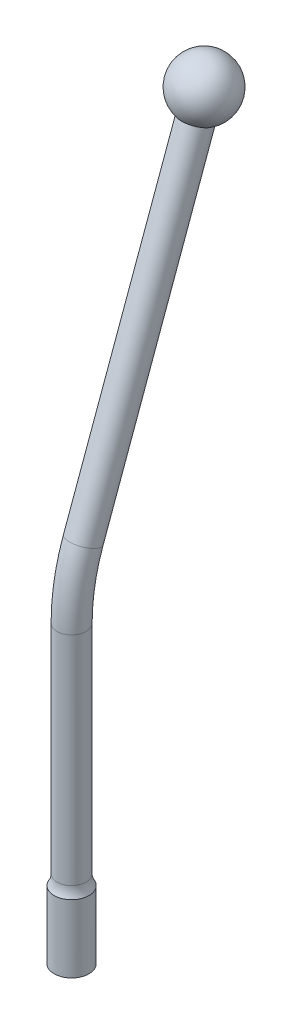
ISO-10303-21;
HEADER;
FILE_DESCRIPTION(('STEP AP214'),'2;1');
FILE_NAME('part.step','',(''),(''),'','','');
FILE_SCHEMA(('AUTOMOTIVE_DESIGN { 1 0 10303 214 1 1 1 1 }'));
ENDSEC;
DATA;
#1=APPLICATION_CONTEXT('core data for automotive mechanical design processes');
#2=APPLICATION_PROTOCOL_DEFINITION('international standard','automotive_design',2000,#1);
#3=PRODUCT_CONTEXT('',#1,'mechanical');
#4=PRODUCT('Part','Part','',(#3));
#5=PRODUCT_RELATED_PRODUCT_CATEGORY('part','',(#4));
#6=PRODUCT_DEFINITION_FORMATION('','',#4);
#7=PRODUCT_DEFINITION_CONTEXT('part definition',#1,'design');
#8=PRODUCT_DEFINITION('design','',#6,#7);
#9=PRODUCT_DEFINITION_SHAPE('','',#8);
#10=(LENGTH_UNIT() NAMED_UNIT(*) SI_UNIT(.MILLI.,.METRE.));
#11=(NAMED_UNIT(*) PLANE_ANGLE_UNIT() SI_UNIT($,.RADIAN.));
#12=(NAMED_UNIT(*) SI_UNIT($,.STERADIAN.) SOLID_ANGLE_UNIT());
#13=UNCERTAINTY_MEASURE_WITH_UNIT(LENGTH_MEASURE(1.E-05),#10,'distance_accuracy_value','');
#14=(GEOMETRIC_REPRESENTATION_CONTEXT(3) GLOBAL_UNCERTAINTY_ASSIGNED_CONTEXT((#13)) GLOBAL_UNIT_ASSIGNED_CONTEXT((#10,
#11,#12)) REPRESENTATION_CONTEXT('',''));
#15=CARTESIAN_POINT('',(0.,0.,0.));
#16=DIRECTION('',(0.,0.,1.));
#17=DIRECTION('',(1.,0.,0.));
#18=AXIS2_PLACEMENT_3D('',#15,#16,#17);
#19=CARTESIAN_POINT('',(0.,35.7938524157182,-6.84040286651327));
#20=DIRECTION('',(0.,-0.939692620785909,0.342020143325666));
#21=DIRECTION('',(0.,-0.342020143325666,-0.939692620785909));
#22=AXIS2_PLACEMENT_3D('',#19,#20,#21);
#23=CYLINDRICAL_SURFACE('',#22,0.75);
#24=CARTESIAN_POINT('',(0.,18.656931626172,-0.603073792140861));
#25=DIRECTION('',(0.,0.939692620785909,-0.342020143325666));
#26=DIRECTION('',(0.,0.342020143325666,0.939692620785909));
#27=AXIS2_PLACEMENT_3D('',#24,#25,#26);
#28=CIRCLE('',#27,0.75);
#29=CARTESIAN_POINT('',(0.,18.9134467336663,0.101695673448572));
#30=VERTEX_POINT('',#29);
#31=EDGE_CURVE('E76',#30,#30,#28,.T.);
#32=ORIENTED_EDGE('',*,*,#31,.T.);
#33=EDGE_LOOP('',(#32));
#34=FACE_BOUND('',#33,.T.);
#35=CARTESIAN_POINT('',(0.,34.5731558936941,-6.39610566742424));
#36=DIRECTION('',(0.,0.93969262078591,-0.342020143325666));
#37=DIRECTION('',(0.,0.342020143325666,0.939692620785909));
#38=AXIS2_PLACEMENT_3D('',#35,#36,#37);
#39=CIRCLE('',#38,0.75);
#40=CARTESIAN_POINT('',(0.,34.8296710011884,-5.69133620183481));
#41=VERTEX_POINT('',#40);
#42=EDGE_CURVE('E60',#41,#41,#39,.T.);
#43=ORIENTED_EDGE('',*,*,#42,.F.);
#44=EDGE_LOOP('',(#43));
#45=FACE_BOUND('',#44,.T.);
#46=ADVANCED_FACE('F52',(#34,#45),#23,.T.);
#47=CARTESIAN_POINT('',(0.,3.5,0.));
#48=DIRECTION('',(0.,-1.,0.));
#49=DIRECTION('',(0.,0.,-1.));
#50=AXIS2_PLACEMENT_3D('',#47,#48,#49);
#51=CYLINDRICAL_SURFACE('',#50,0.9);
#52=CARTESIAN_POINT('',(0.,3.5,0.));
#53=DIRECTION('',(0.,1.,0.));
#54=DIRECTION('',(0.,0.,1.));
#55=AXIS2_PLACEMENT_3D('',#52,#53,#54);
#56=CIRCLE('',#55,0.9);
#57=CARTESIAN_POINT('',(0.,3.5,0.9));
#58=VERTEX_POINT('',#57);
#59=EDGE_CURVE('E64',#58,#58,#56,.T.);
#60=ORIENTED_EDGE('',*,*,#59,.F.);
#61=EDGE_LOOP('',(#60));
#62=FACE_BOUND('',#61,.T.);
#63=CARTESIAN_POINT('',(0.,0.,0.));
#64=DIRECTION('',(0.,1.,0.));
#65=DIRECTION('',(0.,0.,1.));
#66=AXIS2_PLACEMENT_3D('',#63,#64,#65);
#67=CIRCLE('',#66,0.9);
#68=CARTESIAN_POINT('',(0.,0.,0.9));
#69=VERTEX_POINT('',#68);
#70=EDGE_CURVE('E68',#69,#69,#67,.T.);
#71=ORIENTED_EDGE('',*,*,#70,.T.);
#72=EDGE_LOOP('',(#71));
#73=FACE_BOUND('',#72,.T.);
#74=ADVANCED_FACE('F100',(#62,#73),#51,.T.);
#75=CARTESIAN_POINT('',(0.,0.,0.));
#76=DIRECTION('',(0.,1.,0.));
#77=DIRECTION('',(0.,0.,1.));
#78=AXIS2_PLACEMENT_3D('',#75,#76,#77);
#79=PLANE('',#78);
#80=ORIENTED_EDGE('',*,*,#70,.F.);
#81=EDGE_LOOP('',(#80));
#82=FACE_BOUND('',#81,.T.);
#83=ADVANCED_FACE('F97',(#82),#79,.F.);
#84=CARTESIAN_POINT('',(0.,15.2367301929154,-9.99999999999996));
#85=DIRECTION('',(1.,0.,0.));
#86=DIRECTION('',(0.,0.,-1.));
#87=AXIS2_PLACEMENT_3D('',#84,#85,#86);
#88=TOROIDAL_SURFACE('',#87,10.,0.75);
#89=CARTESIAN_POINT('',(0.,15.2367301929154,0.));
#90=DIRECTION('',(0.,1.,0.));
#91=DIRECTION('',(0.,0.,1.));
#92=AXIS2_PLACEMENT_3D('',#89,#90,#91);
#93=CIRCLE('',#92,0.75);
#94=CARTESIAN_POINT('',(0.,15.2367301929154,0.750000000000046));
#95=VERTEX_POINT('',#94);
#96=EDGE_CURVE('E72',#95,#95,#93,.T.);
#97=CARTESIAN_POINT('',(0.,15.2367301929154,-9.99999999999996));
#98=DIRECTION('',(1.,0.,0.));
#99=DIRECTION('',(0.,0.,-1.));
#100=AXIS2_PLACEMENT_3D('',#97,#98,#99);
#101=CIRCLE('',#100,10.75);
#102=EDGE_CURVE('',#30,#95,#101,.T.);
#103=ORIENTED_EDGE('',*,*,#31,.F.);
#104=ORIENTED_EDGE('',*,*,#96,.T.);
#105=ORIENTED_EDGE('',*,*,#102,.T.);
#106=ORIENTED_EDGE('',*,*,#102,.F.);
#107=EDGE_LOOP('',(#103,#105,#104,#106));
#108=FACE_BOUND('',#107,.T.);
#109=ADVANCED_FACE('F99',(#108),#88,.T.);
#110=CARTESIAN_POINT('',(0.,15.2367301929153,0.));
#111=DIRECTION('',(0.,-1.,0.));
#112=DIRECTION('',(0.,0.,-1.));
#113=AXIS2_PLACEMENT_3D('',#110,#111,#112);
#114=CYLINDRICAL_SURFACE('',#113,0.75);
#115=CARTESIAN_POINT('',(0.,4.02678268764264,0.));
#116=DIRECTION('',(0.,-1.,0.));
#117=DIRECTION('',(0.,0.,-1.));
#118=AXIS2_PLACEMENT_3D('',#115,#116,#117);
#119=CIRCLE('',#118,0.75);
#120=CARTESIAN_POINT('',(0.,4.02678268764264,-0.749999999999996));
#121=VERTEX_POINT('',#120);
#122=EDGE_CURVE('E11',#121,#121,#119,.F.);
#123=ORIENTED_EDGE('',*,*,#122,.T.);
#124=EDGE_LOOP('',(#123));
#125=FACE_BOUND('',#124,.T.);
#126=ORIENTED_EDGE('',*,*,#96,.F.);
#127=EDGE_LOOP('',(#126));
#128=FACE_BOUND('',#127,.T.);
#129=ADVANCED_FACE('F95',(#125,#128),#114,.T.);
#130=CARTESIAN_POINT('',(0.,35.7938524157182,-6.84040286651327));
#131=DIRECTION('',(1.,0.,0.));
#132=DIRECTION('',(0.,0.342020143325667,0.939692620785909));
#133=AXIS2_PLACEMENT_3D('',#130,#131,#132);
#134=SPHERICAL_SURFACE('',#133,1.5);
#135=CARTESIAN_POINT('',(0.,35.7938524157182,-6.84040286651327));
#136=DIRECTION('',(0.,0.939692620785909,-0.342020143325666));
#137=DIRECTION('',(0.,0.342020143325666,0.93969262078591));
#138=AXIS2_PLACEMENT_3D('',#135,#136,#137);
#139=SPHERICAL_SURFACE('',#138,1.5);
#140=ORIENTED_EDGE('',*,*,#42,.T.);
#141=EDGE_LOOP('',(#140));
#142=FACE_BOUND('',#141,.T.);
#143=ADVANCED_FACE('F114',(#142),#139,.T.);
#144=CARTESIAN_POINT('',(0.,4.02678268764264,0.));
#145=DIRECTION('',(0.,-1.,0.));
#146=DIRECTION('',(0.,0.,-1.));
#147=AXIS2_PLACEMENT_3D('',#144,#145,#146);
#148=TOROIDAL_SURFACE('',#147,1.75,1.);
#149=ORIENTED_EDGE('',*,*,#122,.F.);
#150=EDGE_LOOP('',(#149));
#151=FACE_BOUND('',#150,.T.);
#152=ORIENTED_EDGE('',*,*,#59,.T.);
#153=EDGE_LOOP('',(#152));
#154=FACE_BOUND('',#153,.T.);
#155=ADVANCED_FACE('F54',(#151,#154),#148,.F.);
#156=CLOSED_SHELL('',(#46,#74,#83,#109,#129,#143,#155));
#157=CARTESIAN_POINT('',(0.,35.7938524157182,-6.84040286651327));
#158=DIRECTION('',(1.,0.,0.));
#159=DIRECTION('',(0.,0.342020143325667,0.939692620785909));
#160=AXIS2_PLACEMENT_3D('',#157,#158,#159);
#161=SPHERICAL_SURFACE('',#160,0.75);
#162=CARTESIAN_POINT('',(0.,35.7938524157182,-6.84040286651327));
#163=DIRECTION('',(0.,-0.939692620785909,0.342020143325666));
#164=DIRECTION('',(0.,-0.342020143325666,-0.939692620785909));
#165=AXIS2_PLACEMENT_3D('',#162,#163,#164);
#166=SPHERICAL_SURFACE('',#165,0.75);
#167=CARTESIAN_POINT('',(0.,35.7938524157182,-6.84040286651327));
#168=DIRECTION('',(0.,-0.939692620785909,0.342020143325666));
#169=DIRECTION('',(0.,-0.342020143325666,-0.939692620785909));
#170=AXIS2_PLACEMENT_3D('',#167,#168,#169);
#171=CIRCLE('',#170,0.75);
#172=CARTESIAN_POINT('',(0.,35.5373373082239,-7.5451723321027));
#173=VERTEX_POINT('',#172);
#174=EDGE_CURVE('E79',#173,#173,#171,.T.);
#175=ORIENTED_EDGE('',*,*,#174,.T.);
#176=EDGE_LOOP('',(#175));
#177=FACE_BOUND('',#176,.T.);
#178=ADVANCED_FACE('F83',(#177),#166,.F.);
#179=CARTESIAN_POINT('',(0.,35.7938524157182,-6.84040286651327));
#180=DIRECTION('',(0.,0.939692620785909,-0.342020143325666));
#181=DIRECTION('',(0.,0.342020143325666,0.939692620785909));
#182=AXIS2_PLACEMENT_3D('',#179,#180,#181);
#183=PLANE('',#182);
#184=ORIENTED_EDGE('',*,*,#174,.F.);
#185=EDGE_LOOP('',(#184));
#186=FACE_BOUND('',#185,.T.);
#187=ADVANCED_FACE('F85',(#186),#183,.T.);
#188=CLOSED_SHELL('',(#178,#187));
#189=ORIENTED_CLOSED_SHELL('',*,#188,.T.);
#190=BREP_WITH_VOIDS('B2',#156,(#189));
#191=ADVANCED_BREP_SHAPE_REPRESENTATION('',(#18,#190),#14);
#192=SHAPE_DEFINITION_REPRESENTATION(#9,#191);
ENDSEC;
END-ISO-10303-21;
